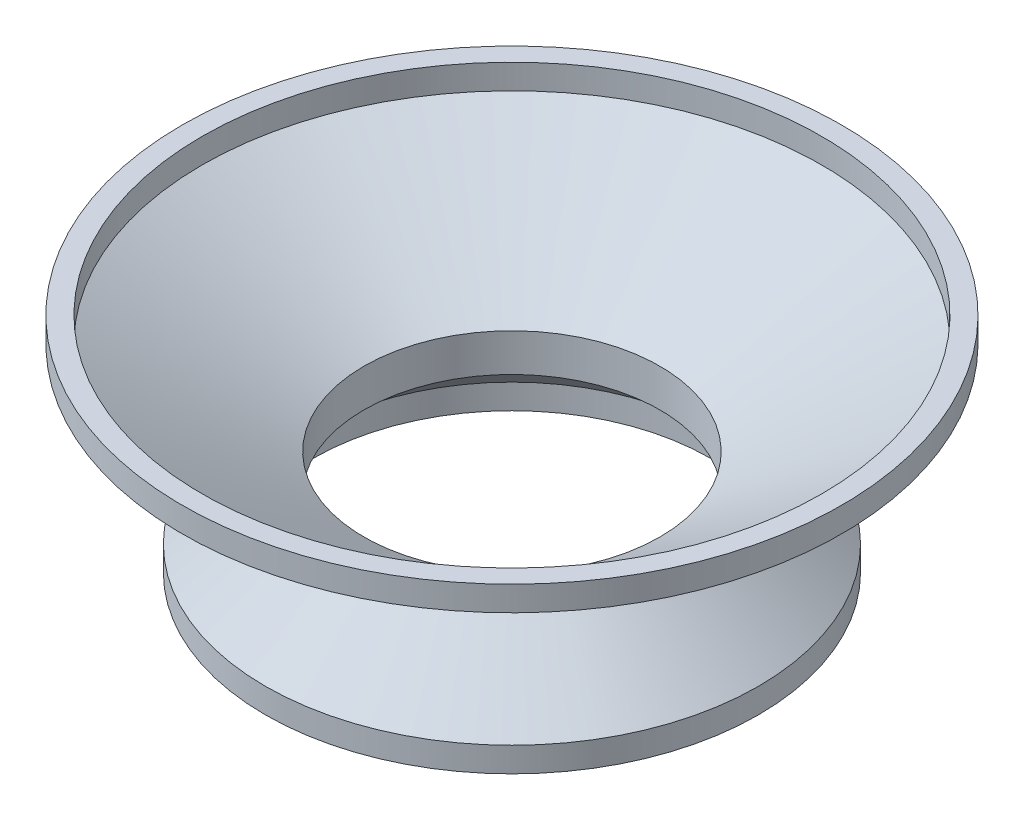
ISO-10303-21;
HEADER;
FILE_DESCRIPTION(('STEP AP214'),'2;1');
FILE_NAME('part.step','',(''),(''),'','','');
FILE_SCHEMA(('AUTOMOTIVE_DESIGN { 1 0 10303 214 1 1 1 1 }'));
ENDSEC;
DATA;
#1=APPLICATION_CONTEXT('core data for automotive mechanical design processes');
#2=APPLICATION_PROTOCOL_DEFINITION('international standard','automotive_design',2000,#1);
#3=PRODUCT_CONTEXT('',#1,'mechanical');
#4=PRODUCT('Part','Part','',(#3));
#5=PRODUCT_RELATED_PRODUCT_CATEGORY('part','',(#4));
#6=PRODUCT_DEFINITION_FORMATION('','',#4);
#7=PRODUCT_DEFINITION_CONTEXT('part definition',#1,'design');
#8=PRODUCT_DEFINITION('design','',#6,#7);
#9=PRODUCT_DEFINITION_SHAPE('','',#8);
#10=(LENGTH_UNIT() NAMED_UNIT(*) SI_UNIT(.MILLI.,.METRE.));
#11=(NAMED_UNIT(*) PLANE_ANGLE_UNIT() SI_UNIT($,.RADIAN.));
#12=(NAMED_UNIT(*) SI_UNIT($,.STERADIAN.) SOLID_ANGLE_UNIT());
#13=UNCERTAINTY_MEASURE_WITH_UNIT(LENGTH_MEASURE(1.E-05),#10,'distance_accuracy_value','');
#14=(GEOMETRIC_REPRESENTATION_CONTEXT(3) GLOBAL_UNCERTAINTY_ASSIGNED_CONTEXT((#13)) GLOBAL_UNIT_ASSIGNED_CONTEXT((#10,
#11,#12)) REPRESENTATION_CONTEXT('',''));
#15=CARTESIAN_POINT('',(0.,0.,0.));
#16=DIRECTION('',(0.,0.,1.));
#17=DIRECTION('',(1.,0.,0.));
#18=AXIS2_PLACEMENT_3D('',#15,#16,#17);
#19=CARTESIAN_POINT('',(13.4063754920828,0.,0.));
#20=DIRECTION('',(0.,-1.,0.));
#21=DIRECTION('',(1.,0.,0.));
#22=AXIS2_PLACEMENT_3D('',#19,#20,#21);
#23=CONICAL_SURFACE('',#22,12.7435935394488,0.872664625997171);
#24=CARTESIAN_POINT('',(13.4063754920828,-0.367198337412941,0.));
#25=DIRECTION('',(0.,-1.,0.));
#26=DIRECTION('',(1.,0.,0.));
#27=AXIS2_PLACEMENT_3D('',#24,#25,#26);
#28=CIRCLE('',#27,13.1812034772553);
#29=CARTESIAN_POINT('',(26.5875789693381,-0.367198337412938,0.));
#30=VERTEX_POINT('',#29);
#31=EDGE_CURVE('E10',#30,#30,#28,.T.);
#32=ORIENTED_EDGE('',*,*,#31,.T.);
#33=EDGE_LOOP('',(#32));
#34=FACE_BOUND('',#33,.T.);
#35=CARTESIAN_POINT('',(13.4063754920828,-6.,0.));
#36=DIRECTION('',(0.,-1.,0.));
#37=DIRECTION('',(1.,0.,0.));
#38=AXIS2_PLACEMENT_3D('',#35,#36,#37);
#39=CIRCLE('',#38,19.8941150950142);
#40=CARTESIAN_POINT('',(33.3004905870969,-5.99999999999999,0.));
#41=VERTEX_POINT('',#40);
#42=EDGE_CURVE('E88',#41,#41,#39,.T.);
#43=ORIENTED_EDGE('',*,*,#42,.F.);
#44=EDGE_LOOP('',(#43));
#45=FACE_BOUND('',#44,.T.);
#46=ADVANCED_FACE('F43',(#34,#45),#23,.T.);
#47=CARTESIAN_POINT('',(13.4063754920828,8.00000000000001,0.));
#48=DIRECTION('',(0.,1.,0.));
#49=DIRECTION('',(-1.,0.,0.));
#50=AXIS2_PLACEMENT_3D('',#47,#48,#49);
#51=CONICAL_SURFACE('',#50,26.6,1.0471975511966);
#52=CARTESIAN_POINT('',(13.4063754920828,0.285629601348428,0.));
#53=DIRECTION('',(0.,1.,0.));
#54=DIRECTION('',(-1.,0.,0.));
#55=AXIS2_PLACEMENT_3D('',#52,#53,#54);
#56=CIRCLE('',#55,13.2383185211299);
#57=CARTESIAN_POINT('',(0.168056970952849,0.285629601348425,0.));
#58=VERTEX_POINT('',#57);
#59=EDGE_CURVE('E51',#58,#58,#56,.T.);
#60=ORIENTED_EDGE('',*,*,#59,.T.);
#61=EDGE_LOOP('',(#60));
#62=FACE_BOUND('',#61,.T.);
#63=CARTESIAN_POINT('',(13.4063754920828,8.00000000000001,0.));
#64=DIRECTION('',(0.,1.,0.));
#65=DIRECTION('',(-1.,0.,0.));
#66=AXIS2_PLACEMENT_3D('',#63,#64,#65);
#67=CIRCLE('',#66,26.6);
#68=CARTESIAN_POINT('',(-13.1936245079172,8.,0.));
#69=VERTEX_POINT('',#68);
#70=EDGE_CURVE('E56',#69,#69,#67,.T.);
#71=ORIENTED_EDGE('',*,*,#70,.F.);
#72=EDGE_LOOP('',(#71));
#73=FACE_BOUND('',#72,.T.);
#74=ADVANCED_FACE('F120',(#62,#73),#51,.T.);
#75=CARTESIAN_POINT('',(13.4063754920828,0.461880215351707,0.));
#76=DIRECTION('',(0.,1.,0.));
#77=DIRECTION('',(-1.,0.,0.));
#78=AXIS2_PLACEMENT_3D('',#75,#76,#77);
#79=CONICAL_SURFACE('',#78,11.9435935394488,1.0471975511966);
#80=CARTESIAN_POINT('',(13.4063754920828,8.00000000000001,0.));
#81=DIRECTION('',(0.,1.,0.));
#82=DIRECTION('',(-1.,0.,0.));
#83=AXIS2_PLACEMENT_3D('',#80,#81,#82);
#84=CIRCLE('',#83,25.);
#85=CARTESIAN_POINT('',(-11.5936245079172,8.,0.));
#86=VERTEX_POINT('',#85);
#87=EDGE_CURVE('E80',#86,#86,#84,.T.);
#88=ORIENTED_EDGE('',*,*,#87,.T.);
#89=EDGE_LOOP('',(#88));
#90=FACE_BOUND('',#89,.T.);
#91=CARTESIAN_POINT('',(13.4063754920828,0.461880215351707,0.));
#92=DIRECTION('',(0.,1.,0.));
#93=DIRECTION('',(-1.,0.,0.));
#94=AXIS2_PLACEMENT_3D('',#91,#92,#93);
#95=CIRCLE('',#94,11.9435935394488);
#96=CARTESIAN_POINT('',(1.46278195263397,0.461880215351704,0.));
#97=VERTEX_POINT('',#96);
#98=EDGE_CURVE('E61',#97,#97,#95,.T.);
#99=ORIENTED_EDGE('',*,*,#98,.F.);
#100=EDGE_LOOP('',(#99));
#101=FACE_BOUND('',#100,.T.);
#102=ADVANCED_FACE('F125',(#90,#101),#79,.F.);
#103=CARTESIAN_POINT('',(13.4063754920828,7.60901803281973,0.));
#104=DIRECTION('',(0.,1.,0.));
#105=DIRECTION('',(-1.,0.,0.));
#106=AXIS2_PLACEMENT_3D('',#103,#104,#105);
#107=CYLINDRICAL_SURFACE('',#106,11.9435935394488);
#108=ORIENTED_EDGE('',*,*,#98,.T.);
#109=EDGE_LOOP('',(#108));
#110=FACE_BOUND('',#109,.T.);
#111=CARTESIAN_POINT('',(13.4063754920828,-2.59223851838886,0.));
#112=DIRECTION('',(0.,1.,0.));
#113=DIRECTION('',(-1.,0.,0.));
#114=AXIS2_PLACEMENT_3D('',#111,#112,#113);
#115=CIRCLE('',#114,11.9435935394488);
#116=CARTESIAN_POINT('',(1.46278195263397,-2.59223851838886,0.));
#117=VERTEX_POINT('',#116);
#118=EDGE_CURVE('E67',#117,#117,#115,.T.);
#119=ORIENTED_EDGE('',*,*,#118,.F.);
#120=EDGE_LOOP('',(#119));
#121=FACE_BOUND('',#120,.T.);
#122=ADVANCED_FACE('F131',(#110,#121),#107,.F.);
#123=CARTESIAN_POINT('',(13.4063754920828,-6.,0.));
#124=DIRECTION('',(0.,-1.,0.));
#125=DIRECTION('',(1.,0.,0.));
#126=AXIS2_PLACEMENT_3D('',#123,#124,#125);
#127=CONICAL_SURFACE('',#126,16.0048055278631,0.872664625997171);
#128=ORIENTED_EDGE('',*,*,#118,.T.);
#129=EDGE_LOOP('',(#128));
#130=FACE_BOUND('',#129,.T.);
#131=CARTESIAN_POINT('',(13.4063754920828,-6.,0.));
#132=DIRECTION('',(0.,1.,0.));
#133=DIRECTION('',(-1.,0.,0.));
#134=AXIS2_PLACEMENT_3D('',#131,#132,#133);
#135=CIRCLE('',#134,16.0048055278631);
#136=CARTESIAN_POINT('',(-2.59843003578032,-6.,0.));
#137=VERTEX_POINT('',#136);
#138=EDGE_CURVE('E71',#137,#137,#135,.T.);
#139=ORIENTED_EDGE('',*,*,#138,.F.);
#140=EDGE_LOOP('',(#139));
#141=FACE_BOUND('',#140,.T.);
#142=ADVANCED_FACE('F135',(#130,#141),#127,.F.);
#143=CARTESIAN_POINT('',(13.4063754920828,-0.0607805601653497,0.));
#144=DIRECTION('',(0.,1.,0.));
#145=DIRECTION('',(-1.,0.,0.));
#146=AXIS2_PLACEMENT_3D('',#143,#144,#145);
#147=TOROIDAL_SURFACE('',#146,13.4383185211299,0.4);
#148=ORIENTED_EDGE('',*,*,#31,.F.);
#149=EDGE_LOOP('',(#148));
#150=FACE_BOUND('',#149,.T.);
#151=ORIENTED_EDGE('',*,*,#59,.F.);
#152=EDGE_LOOP('',(#151));
#153=FACE_BOUND('',#152,.T.);
#154=ADVANCED_FACE('F45',(#150,#153),#147,.F.);
#155=CARTESIAN_POINT('',(13.4063754920828,10.,0.));
#156=DIRECTION('',(0.,1.,0.));
#157=DIRECTION('',(-1.,0.,0.));
#158=AXIS2_PLACEMENT_3D('',#155,#156,#157);
#159=PLANE('',#158);
#160=CARTESIAN_POINT('',(13.4063754920828,10.,0.));
#161=DIRECTION('',(0.,1.,0.));
#162=DIRECTION('',(-1.,0.,0.));
#163=AXIS2_PLACEMENT_3D('',#160,#161,#162);
#164=CIRCLE('',#163,26.6);
#165=CARTESIAN_POINT('',(-13.1936245079172,10.,0.));
#166=VERTEX_POINT('',#165);
#167=EDGE_CURVE('E75',#166,#166,#164,.T.);
#168=ORIENTED_EDGE('',*,*,#167,.T.);
#169=EDGE_LOOP('',(#168));
#170=FACE_BOUND('',#169,.T.);
#171=CARTESIAN_POINT('',(13.4063754920828,10.,0.));
#172=DIRECTION('',(0.,1.,0.));
#173=DIRECTION('',(-1.,0.,0.));
#174=AXIS2_PLACEMENT_3D('',#171,#172,#173);
#175=CIRCLE('',#174,25.);
#176=CARTESIAN_POINT('',(-11.5936245079172,10.,0.));
#177=VERTEX_POINT('',#176);
#178=EDGE_CURVE('E79',#177,#177,#175,.T.);
#179=ORIENTED_EDGE('',*,*,#178,.F.);
#180=EDGE_LOOP('',(#179));
#181=FACE_BOUND('',#180,.T.);
#182=ADVANCED_FACE('F141',(#170,#181),#159,.T.);
#183=CARTESIAN_POINT('',(13.4063754920828,10.,0.));
#184=DIRECTION('',(0.,-1.,0.));
#185=DIRECTION('',(1.,0.,0.));
#186=AXIS2_PLACEMENT_3D('',#183,#184,#185);
#187=CYLINDRICAL_SURFACE('',#186,26.6);
#188=ORIENTED_EDGE('',*,*,#167,.F.);
#189=EDGE_LOOP('',(#188));
#190=FACE_BOUND('',#189,.T.);
#191=ORIENTED_EDGE('',*,*,#70,.T.);
#192=EDGE_LOOP('',(#191));
#193=FACE_BOUND('',#192,.T.);
#194=ADVANCED_FACE('F115',(#190,#193),#187,.T.);
#195=CARTESIAN_POINT('',(13.4063754920828,10.,0.));
#196=DIRECTION('',(0.,-1.,0.));
#197=DIRECTION('',(1.,0.,0.));
#198=AXIS2_PLACEMENT_3D('',#195,#196,#197);
#199=CYLINDRICAL_SURFACE('',#198,25.);
#200=ORIENTED_EDGE('',*,*,#178,.T.);
#201=EDGE_LOOP('',(#200));
#202=FACE_BOUND('',#201,.T.);
#203=ORIENTED_EDGE('',*,*,#87,.F.);
#204=EDGE_LOOP('',(#203));
#205=FACE_BOUND('',#204,.T.);
#206=ADVANCED_FACE('F106',(#202,#205),#199,.F.);
#207=CARTESIAN_POINT('',(13.4063754920828,-7.99999999999999,0.));
#208=DIRECTION('',(0.,-1.,0.));
#209=DIRECTION('',(1.,0.,0.));
#210=AXIS2_PLACEMENT_3D('',#207,#208,#209);
#211=PLANE('',#210);
#212=CARTESIAN_POINT('',(13.4063754920828,-7.99999999999999,0.));
#213=DIRECTION('',(0.,-1.,0.));
#214=DIRECTION('',(1.,0.,0.));
#215=AXIS2_PLACEMENT_3D('',#212,#213,#214);
#216=CIRCLE('',#215,19.8941150950142);
#217=CARTESIAN_POINT('',(33.3004905870969,-7.99999999999999,0.));
#218=VERTEX_POINT('',#217);
#219=EDGE_CURVE('E84',#218,#218,#216,.T.);
#220=ORIENTED_EDGE('',*,*,#219,.T.);
#221=EDGE_LOOP('',(#220));
#222=FACE_BOUND('',#221,.T.);
#223=CARTESIAN_POINT('',(13.4063754920828,-7.99999999999999,0.));
#224=DIRECTION('',(0.,-1.,0.));
#225=DIRECTION('',(1.,0.,0.));
#226=AXIS2_PLACEMENT_3D('',#223,#224,#225);
#227=CIRCLE('',#226,16.0048055278631);
#228=CARTESIAN_POINT('',(29.4111810199459,-7.99999999999999,0.));
#229=VERTEX_POINT('',#228);
#230=EDGE_CURVE('E92',#229,#229,#227,.T.);
#231=ORIENTED_EDGE('',*,*,#230,.F.);
#232=EDGE_LOOP('',(#231));
#233=FACE_BOUND('',#232,.T.);
#234=ADVANCED_FACE('F103',(#222,#233),#211,.T.);
#235=CARTESIAN_POINT('',(13.4063754920828,-7.99999999999999,0.));
#236=DIRECTION('',(0.,1.,0.));
#237=DIRECTION('',(-1.,0.,0.));
#238=AXIS2_PLACEMENT_3D('',#235,#236,#237);
#239=CYLINDRICAL_SURFACE('',#238,19.8941150950142);
#240=ORIENTED_EDGE('',*,*,#219,.F.);
#241=EDGE_LOOP('',(#240));
#242=FACE_BOUND('',#241,.T.);
#243=ORIENTED_EDGE('',*,*,#42,.T.);
#244=EDGE_LOOP('',(#243));
#245=FACE_BOUND('',#244,.T.);
#246=ADVANCED_FACE('F105',(#242,#245),#239,.T.);
#247=CARTESIAN_POINT('',(13.4063754920828,-7.99999999999999,0.));
#248=DIRECTION('',(0.,1.,0.));
#249=DIRECTION('',(-1.,0.,0.));
#250=AXIS2_PLACEMENT_3D('',#247,#248,#249);
#251=CYLINDRICAL_SURFACE('',#250,16.0048055278631);
#252=ORIENTED_EDGE('',*,*,#230,.T.);
#253=EDGE_LOOP('',(#252));
#254=FACE_BOUND('',#253,.T.);
#255=ORIENTED_EDGE('',*,*,#138,.T.);
#256=EDGE_LOOP('',(#255));
#257=FACE_BOUND('',#256,.T.);
#258=ADVANCED_FACE('F100',(#254,#257),#251,.F.);
#259=CLOSED_SHELL('',(#46,#74,#102,#122,#142,#154,#182,#194,#206,#234,#246,#258));
#260=MANIFOLD_SOLID_BREP('B2',#259);
#261=ADVANCED_BREP_SHAPE_REPRESENTATION('',(#18,#260),#14);
#262=SHAPE_DEFINITION_REPRESENTATION(#9,#261);
ENDSEC;
END-ISO-10303-21;
